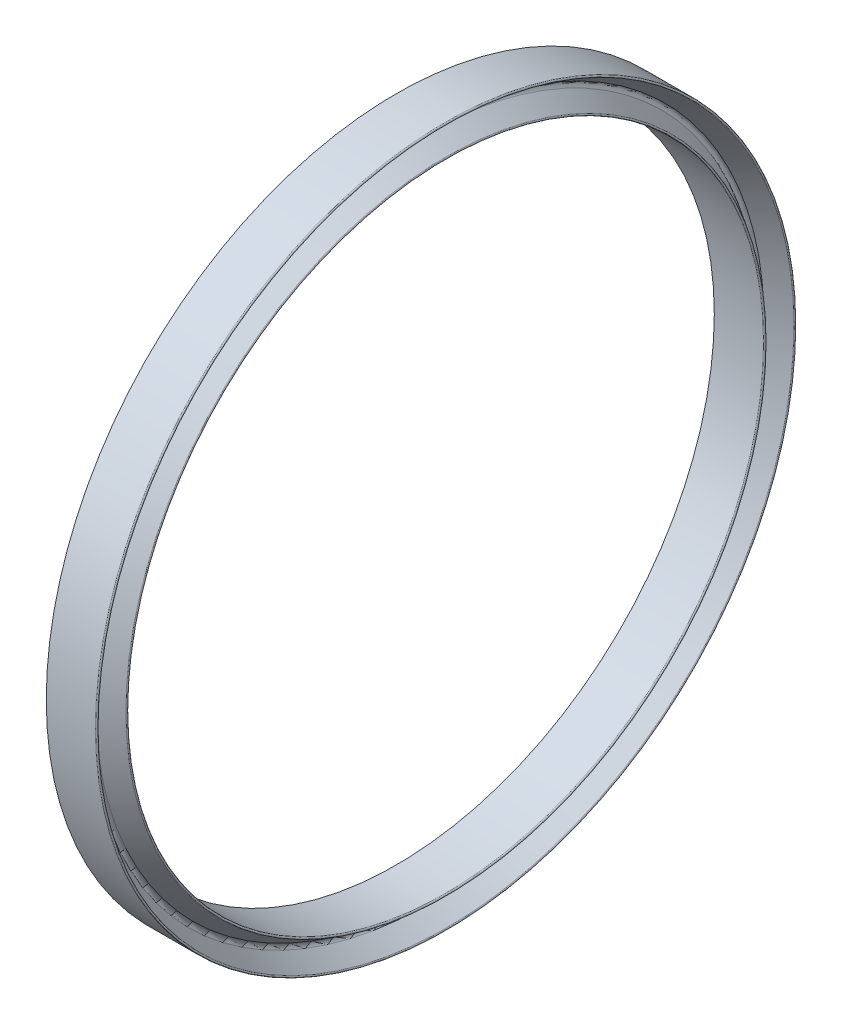
ISO-10303-21;
HEADER;
FILE_DESCRIPTION(('STEP AP214'),'2;1');
FILE_NAME('part.step','',(''),(''),'','','');
FILE_SCHEMA(('AUTOMOTIVE_DESIGN { 1 0 10303 214 1 1 1 1 }'));
ENDSEC;
DATA;
#1=APPLICATION_CONTEXT('core data for automotive mechanical design processes');
#2=APPLICATION_PROTOCOL_DEFINITION('international standard','automotive_design',2000,#1);
#3=PRODUCT_CONTEXT('',#1,'mechanical');
#4=PRODUCT('Part','Part','',(#3));
#5=PRODUCT_RELATED_PRODUCT_CATEGORY('part','',(#4));
#6=PRODUCT_DEFINITION_FORMATION('','',#4);
#7=PRODUCT_DEFINITION_CONTEXT('part definition',#1,'design');
#8=PRODUCT_DEFINITION('design','',#6,#7);
#9=PRODUCT_DEFINITION_SHAPE('','',#8);
#10=(LENGTH_UNIT() NAMED_UNIT(*) SI_UNIT(.MILLI.,.METRE.));
#11=(NAMED_UNIT(*) PLANE_ANGLE_UNIT() SI_UNIT($,.RADIAN.));
#12=(NAMED_UNIT(*) SI_UNIT($,.STERADIAN.) SOLID_ANGLE_UNIT());
#13=UNCERTAINTY_MEASURE_WITH_UNIT(LENGTH_MEASURE(1.E-05),#10,'distance_accuracy_value','');
#14=(GEOMETRIC_REPRESENTATION_CONTEXT(3) GLOBAL_UNCERTAINTY_ASSIGNED_CONTEXT((#13)) GLOBAL_UNIT_ASSIGNED_CONTEXT((#10,
#11,#12)) REPRESENTATION_CONTEXT('',''));
#15=CARTESIAN_POINT('',(0.,0.,0.));
#16=DIRECTION('',(0.,0.,1.));
#17=DIRECTION('',(1.,0.,0.));
#18=AXIS2_PLACEMENT_3D('',#15,#16,#17);
#19=CARTESIAN_POINT('',(-65.1991103975833,-33.,0.));
#20=DIRECTION('',(-1.,0.,0.));
#21=DIRECTION('',(0.,0.,1.));
#22=AXIS2_PLACEMENT_3D('',#19,#20,#21);
#23=PLANE('',#22);
#24=CARTESIAN_POINT('',(-65.1991103975833,0.,0.));
#25=DIRECTION('',(-1.,0.,0.));
#26=DIRECTION('',(0.,0.,1.));
#27=AXIS2_PLACEMENT_3D('',#24,#25,#26);
#28=CIRCLE('',#27,33.);
#29=CARTESIAN_POINT('',(-65.1991103975833,0.,33.));
#30=VERTEX_POINT('',#29);
#31=EDGE_CURVE('E72',#30,#30,#28,.T.);
#32=ORIENTED_EDGE('',*,*,#31,.T.);
#33=EDGE_LOOP('',(#32));
#34=FACE_BOUND('',#33,.T.);
#35=CARTESIAN_POINT('',(-65.1991103975833,0.,0.));
#36=DIRECTION('',(-1.,0.,0.));
#37=DIRECTION('',(0.,0.,1.));
#38=AXIS2_PLACEMENT_3D('',#35,#36,#37);
#39=CIRCLE('',#38,30.);
#40=CARTESIAN_POINT('',(-65.1991103975833,0.,30.));
#41=VERTEX_POINT('',#40);
#42=EDGE_CURVE('E10',#41,#41,#39,.T.);
#43=ORIENTED_EDGE('',*,*,#42,.F.);
#44=EDGE_LOOP('',(#43));
#45=FACE_BOUND('',#44,.T.);
#46=ADVANCED_FACE('F34',(#34,#45),#23,.T.);
#47=CARTESIAN_POINT('',(-81.3053308348063,0.,0.));
#48=DIRECTION('',(-1.,0.,0.));
#49=DIRECTION('',(0.,0.,1.));
#50=AXIS2_PLACEMENT_3D('',#47,#48,#49);
#51=CYLINDRICAL_SURFACE('',#50,30.);
#52=ORIENTED_EDGE('',*,*,#42,.T.);
#53=EDGE_LOOP('',(#52));
#54=FACE_BOUND('',#53,.T.);
#55=CARTESIAN_POINT('',(-60.5601421274115,0.,0.));
#56=DIRECTION('',(-1.,0.,0.));
#57=DIRECTION('',(0.,0.,1.));
#58=AXIS2_PLACEMENT_3D('',#55,#56,#57);
#59=CIRCLE('',#58,30.);
#60=CARTESIAN_POINT('',(-60.5601421274115,0.,30.));
#61=VERTEX_POINT('',#60);
#62=EDGE_CURVE('E41',#61,#61,#59,.T.);
#63=ORIENTED_EDGE('',*,*,#62,.F.);
#64=EDGE_LOOP('',(#63));
#65=FACE_BOUND('',#64,.T.);
#66=ADVANCED_FACE('F92',(#54,#65),#51,.F.);
#67=CARTESIAN_POINT('',(-60.5601421274115,0.,0.));
#68=DIRECTION('',(-1.,0.,0.));
#69=DIRECTION('',(0.,0.,1.));
#70=AXIS2_PLACEMENT_3D('',#67,#68,#69);
#71=TOROIDAL_SURFACE('',#70,30.1,0.1);
#72=ORIENTED_EDGE('',*,*,#62,.T.);
#73=EDGE_LOOP('',(#72));
#74=FACE_BOUND('',#73,.T.);
#75=CARTESIAN_POINT('',(-60.5086925518687,0.,0.));
#76=DIRECTION('',(-1.,0.,0.));
#77=DIRECTION('',(0.,0.,1.));
#78=AXIS2_PLACEMENT_3D('',#75,#76,#77);
#79=CIRCLE('',#78,30.1857492925713);
#80=CARTESIAN_POINT('',(-60.5086925518687,0.,30.1857492925713));
#81=VERTEX_POINT('',#80);
#82=EDGE_CURVE('E48',#81,#81,#79,.T.);
#83=ORIENTED_EDGE('',*,*,#82,.F.);
#84=EDGE_LOOP('',(#83));
#85=FACE_BOUND('',#84,.T.);
#86=ADVANCED_FACE('F96',(#74,#85),#71,.T.);
#87=CARTESIAN_POINT('',(-62.270363934727,0.,0.));
#88=DIRECTION('',(-1.,0.,0.));
#89=DIRECTION('',(0.,0.,1.));
#90=AXIS2_PLACEMENT_3D('',#87,#88,#89);
#91=CONICAL_SURFACE('',#90,31.2427521222862,0.540419500270591);
#92=ORIENTED_EDGE('',*,*,#82,.T.);
#93=EDGE_LOOP('',(#92));
#94=FACE_BOUND('',#93,.T.);
#95=CARTESIAN_POINT('',(-62.270363934727,0.,0.));
#96=DIRECTION('',(-1.,0.,0.));
#97=DIRECTION('',(0.,0.,1.));
#98=AXIS2_PLACEMENT_3D('',#95,#96,#97);
#99=CIRCLE('',#98,31.2427521222862);
#100=CARTESIAN_POINT('',(-62.270363934727,0.,31.2427521222862));
#101=VERTEX_POINT('',#100);
#102=EDGE_CURVE('E54',#101,#101,#99,.T.);
#103=ORIENTED_EDGE('',*,*,#102,.F.);
#104=EDGE_LOOP('',(#103));
#105=FACE_BOUND('',#104,.T.);
#106=ADVANCED_FACE('F100',(#94,#105),#91,.T.);
#107=CARTESIAN_POINT('',(-62.1160152080987,0.,0.));
#108=DIRECTION('',(-1.,0.,0.));
#109=DIRECTION('',(0.,0.,1.));
#110=AXIS2_PLACEMENT_3D('',#107,#108,#109);
#111=TOROIDAL_SURFACE('',#110,31.5,0.299999999999989);
#112=ORIENTED_EDGE('',*,*,#102,.T.);
#113=EDGE_LOOP('',(#112));
#114=FACE_BOUND('',#113,.T.);
#115=CARTESIAN_POINT('',(-62.270363934727,0.,0.));
#116=DIRECTION('',(-1.,0.,0.));
#117=DIRECTION('',(0.,0.,1.));
#118=AXIS2_PLACEMENT_3D('',#115,#116,#117);
#119=CIRCLE('',#118,31.7572478777138);
#120=CARTESIAN_POINT('',(-62.270363934727,0.,31.7572478777138));
#121=VERTEX_POINT('',#120);
#122=EDGE_CURVE('E60',#121,#121,#119,.T.);
#123=ORIENTED_EDGE('',*,*,#122,.F.);
#124=EDGE_LOOP('',(#123));
#125=FACE_BOUND('',#124,.T.);
#126=ADVANCED_FACE('F106',(#114,#125),#111,.F.);
#127=CARTESIAN_POINT('',(-60.5086925518687,0.,0.));
#128=DIRECTION('',(1.,0.,0.));
#129=DIRECTION('',(0.,0.,-1.));
#130=AXIS2_PLACEMENT_3D('',#127,#128,#129);
#131=CONICAL_SURFACE('',#130,32.8142507074287,0.540419500270596);
#132=ORIENTED_EDGE('',*,*,#122,.T.);
#133=EDGE_LOOP('',(#132));
#134=FACE_BOUND('',#133,.T.);
#135=CARTESIAN_POINT('',(-60.5086925518687,0.,0.));
#136=DIRECTION('',(-1.,0.,0.));
#137=DIRECTION('',(0.,0.,1.));
#138=AXIS2_PLACEMENT_3D('',#135,#136,#137);
#139=CIRCLE('',#138,32.8142507074287);
#140=CARTESIAN_POINT('',(-60.5086925518687,0.,32.8142507074287));
#141=VERTEX_POINT('',#140);
#142=EDGE_CURVE('E64',#141,#141,#139,.T.);
#143=ORIENTED_EDGE('',*,*,#142,.F.);
#144=EDGE_LOOP('',(#143));
#145=FACE_BOUND('',#144,.T.);
#146=ADVANCED_FACE('F88',(#134,#145),#131,.F.);
#147=CARTESIAN_POINT('',(-60.5601421274115,0.,0.));
#148=DIRECTION('',(-1.,0.,0.));
#149=DIRECTION('',(0.,0.,1.));
#150=AXIS2_PLACEMENT_3D('',#147,#148,#149);
#151=TOROIDAL_SURFACE('',#150,32.9,0.0999999999999991);
#152=ORIENTED_EDGE('',*,*,#142,.T.);
#153=EDGE_LOOP('',(#152));
#154=FACE_BOUND('',#153,.T.);
#155=CARTESIAN_POINT('',(-60.5601421274115,0.,0.));
#156=DIRECTION('',(-1.,0.,0.));
#157=DIRECTION('',(0.,0.,1.));
#158=AXIS2_PLACEMENT_3D('',#155,#156,#157);
#159=CIRCLE('',#158,33.);
#160=CARTESIAN_POINT('',(-60.5601421274115,0.,33.));
#161=VERTEX_POINT('',#160);
#162=EDGE_CURVE('E68',#161,#161,#159,.T.);
#163=ORIENTED_EDGE('',*,*,#162,.F.);
#164=EDGE_LOOP('',(#163));
#165=FACE_BOUND('',#164,.T.);
#166=ADVANCED_FACE('F82',(#154,#165),#151,.T.);
#167=CARTESIAN_POINT('',(-81.3053308348063,0.,0.));
#168=DIRECTION('',(-1.,0.,0.));
#169=DIRECTION('',(0.,0.,1.));
#170=AXIS2_PLACEMENT_3D('',#167,#168,#169);
#171=CYLINDRICAL_SURFACE('',#170,33.);
#172=ORIENTED_EDGE('',*,*,#162,.T.);
#173=EDGE_LOOP('',(#172));
#174=FACE_BOUND('',#173,.T.);
#175=ORIENTED_EDGE('',*,*,#31,.F.);
#176=EDGE_LOOP('',(#175));
#177=FACE_BOUND('',#176,.T.);
#178=ADVANCED_FACE('F80',(#174,#177),#171,.T.);
#179=CLOSED_SHELL('',(#46,#66,#86,#106,#126,#146,#166,#178));
#180=MANIFOLD_SOLID_BREP('B2',#179);
#181=ADVANCED_BREP_SHAPE_REPRESENTATION('',(#18,#180),#14);
#182=SHAPE_DEFINITION_REPRESENTATION(#9,#181);
ENDSEC;
END-ISO-10303-21;
